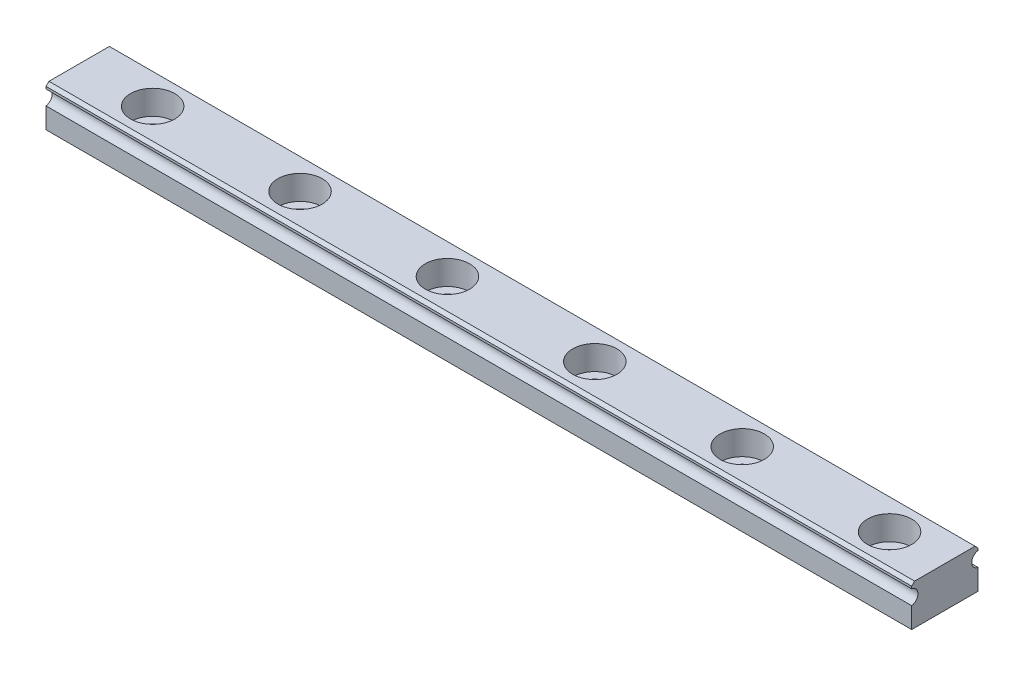
ISO-10303-21;
HEADER;
FILE_DESCRIPTION(('STEP AP214'),'2;1');
FILE_NAME('part.step','',(''),(''),'','','');
FILE_SCHEMA(('AUTOMOTIVE_DESIGN { 1 0 10303 214 1 1 1 1 }'));
ENDSEC;
DATA;
#1=APPLICATION_CONTEXT('core data for automotive mechanical design processes');
#2=APPLICATION_PROTOCOL_DEFINITION('international standard','automotive_design',2000,#1);
#3=PRODUCT_CONTEXT('',#1,'mechanical');
#4=PRODUCT('Part','Part','',(#3));
#5=PRODUCT_RELATED_PRODUCT_CATEGORY('part','',(#4));
#6=PRODUCT_DEFINITION_FORMATION('','',#4);
#7=PRODUCT_DEFINITION_CONTEXT('part definition',#1,'design');
#8=PRODUCT_DEFINITION('design','',#6,#7);
#9=PRODUCT_DEFINITION_SHAPE('','',#8);
#10=(LENGTH_UNIT() NAMED_UNIT(*) SI_UNIT(.MILLI.,.METRE.));
#11=(NAMED_UNIT(*) PLANE_ANGLE_UNIT() SI_UNIT($,.RADIAN.));
#12=(NAMED_UNIT(*) SI_UNIT($,.STERADIAN.) SOLID_ANGLE_UNIT());
#13=UNCERTAINTY_MEASURE_WITH_UNIT(LENGTH_MEASURE(1.E-05),#10,'distance_accuracy_value','');
#14=(GEOMETRIC_REPRESENTATION_CONTEXT(3) GLOBAL_UNCERTAINTY_ASSIGNED_CONTEXT((#13)) GLOBAL_UNIT_ASSIGNED_CONTEXT((#10,
#11,#12)) REPRESENTATION_CONTEXT('',''));
#15=CARTESIAN_POINT('',(0.,0.,0.));
#16=DIRECTION('',(0.,0.,1.));
#17=DIRECTION('',(1.,0.,0.));
#18=AXIS2_PLACEMENT_3D('',#15,#16,#17);
#19=CARTESIAN_POINT('',(187.5,4.78868599666426,-4.5));
#20=DIRECTION('',(0.,0.,1.));
#21=DIRECTION('',(1.,0.,0.));
#22=AXIS2_PLACEMENT_3D('',#19,#20,#21);
#23=PLANE('',#22);
#24=DIRECTION('',(1.,0.,0.));
#25=VECTOR('',#24,1.);
#26=CARTESIAN_POINT('',(187.5,4.78868599666426,-4.5));
#27=LINE('',#26,#25);
#28=CARTESIAN_POINT('',(187.5,4.78868599666426,-4.5));
#29=VERTEX_POINT('',#28);
#30=CARTESIAN_POINT('',(70.025,4.78868599666426,-4.5));
#31=VERTEX_POINT('',#30);
#32=EDGE_CURVE('E206',#29,#31,#27,.F.);
#33=ORIENTED_EDGE('',*,*,#32,.T.);
#34=DIRECTION('',(0.,1.,0.));
#35=VECTOR('',#34,1.);
#36=CARTESIAN_POINT('',(70.025,4.78868599666426,-4.5));
#37=LINE('',#36,#35);
#38=CARTESIAN_POINT('',(70.025,5.1,-4.5));
#39=VERTEX_POINT('',#38);
#40=EDGE_CURVE('E279',#31,#39,#37,.T.);
#41=ORIENTED_EDGE('',*,*,#40,.T.);
#42=DIRECTION('',(1.,0.,0.));
#43=VECTOR('',#42,1.);
#44=CARTESIAN_POINT('',(187.5,5.1,-4.5));
#45=LINE('',#44,#43);
#46=CARTESIAN_POINT('',(187.5,5.1,-4.5));
#47=VERTEX_POINT('',#46);
#48=EDGE_CURVE('E37',#39,#47,#45,.T.);
#49=ORIENTED_EDGE('',*,*,#48,.T.);
#50=DIRECTION('',(0.,1.,0.));
#51=VECTOR('',#50,1.);
#52=CARTESIAN_POINT('',(187.5,4.78868599666426,-4.5));
#53=LINE('',#52,#51);
#54=EDGE_CURVE('E90',#29,#47,#53,.T.);
#55=ORIENTED_EDGE('',*,*,#54,.F.);
#56=EDGE_LOOP('',(#33,#41,#49,#55));
#57=FACE_BOUND('',#56,.T.);
#58=ADVANCED_FACE('F34',(#57),#23,.F.);
#59=CARTESIAN_POINT('',(160.,0.,0.));
#60=DIRECTION('',(0.,1.,0.));
#61=DIRECTION('',(0.,0.,1.));
#62=AXIS2_PLACEMENT_3D('',#59,#60,#61);
#63=CYLINDRICAL_SURFACE('',#62,3.);
#64=CARTESIAN_POINT('',(160.,5.5,0.));
#65=DIRECTION('',(0.,1.,0.));
#66=DIRECTION('',(0.,0.,1.));
#67=AXIS2_PLACEMENT_3D('',#64,#65,#66);
#68=CIRCLE('',#67,3.);
#69=CARTESIAN_POINT('',(160.,5.5,3.));
#70=VERTEX_POINT('',#69);
#71=EDGE_CURVE('E203',#70,#70,#68,.T.);
#72=ORIENTED_EDGE('',*,*,#71,.T.);
#73=EDGE_LOOP('',(#72));
#74=FACE_BOUND('',#73,.T.);
#75=CARTESIAN_POINT('',(160.,2.2,0.));
#76=DIRECTION('',(0.,1.,0.));
#77=DIRECTION('',(0.,0.,1.));
#78=AXIS2_PLACEMENT_3D('',#75,#76,#77);
#79=CIRCLE('',#78,3.);
#80=CARTESIAN_POINT('',(160.,2.2,3.));
#81=VERTEX_POINT('',#80);
#82=EDGE_CURVE('E213',#81,#81,#79,.T.);
#83=ORIENTED_EDGE('',*,*,#82,.F.);
#84=EDGE_LOOP('',(#83));
#85=FACE_BOUND('',#84,.T.);
#86=ADVANCED_FACE('F580',(#74,#85),#63,.F.);
#87=CARTESIAN_POINT('',(120.,0.,0.));
#88=DIRECTION('',(0.,1.,0.));
#89=DIRECTION('',(0.,0.,1.));
#90=AXIS2_PLACEMENT_3D('',#87,#88,#89);
#91=CYLINDRICAL_SURFACE('',#90,3.);
#92=CARTESIAN_POINT('',(120.,5.5,0.));
#93=DIRECTION('',(0.,1.,0.));
#94=DIRECTION('',(0.,0.,1.));
#95=AXIS2_PLACEMENT_3D('',#92,#93,#94);
#96=CIRCLE('',#95,3.);
#97=CARTESIAN_POINT('',(120.,5.5,3.));
#98=VERTEX_POINT('',#97);
#99=EDGE_CURVE('E200',#98,#98,#96,.T.);
#100=ORIENTED_EDGE('',*,*,#99,.T.);
#101=EDGE_LOOP('',(#100));
#102=FACE_BOUND('',#101,.T.);
#103=CARTESIAN_POINT('',(120.,2.2,0.));
#104=DIRECTION('',(0.,1.,0.));
#105=DIRECTION('',(0.,0.,1.));
#106=AXIS2_PLACEMENT_3D('',#103,#104,#105);
#107=CIRCLE('',#106,3.);
#108=CARTESIAN_POINT('',(120.,2.2,3.));
#109=VERTEX_POINT('',#108);
#110=EDGE_CURVE('E210',#109,#109,#107,.T.);
#111=ORIENTED_EDGE('',*,*,#110,.F.);
#112=EDGE_LOOP('',(#111));
#113=FACE_BOUND('',#112,.T.);
#114=ADVANCED_FACE('F444',(#102,#113),#91,.F.);
#115=CARTESIAN_POINT('',(80.,0.,0.));
#116=DIRECTION('',(0.,1.,0.));
#117=DIRECTION('',(0.,0.,1.));
#118=AXIS2_PLACEMENT_3D('',#115,#116,#117);
#119=CYLINDRICAL_SURFACE('',#118,3.);
#120=CARTESIAN_POINT('',(80.,5.5,0.));
#121=DIRECTION('',(0.,1.,0.));
#122=DIRECTION('',(0.,0.,1.));
#123=AXIS2_PLACEMENT_3D('',#120,#121,#122);
#124=CIRCLE('',#123,3.);
#125=CARTESIAN_POINT('',(80.,5.5,3.));
#126=VERTEX_POINT('',#125);
#127=EDGE_CURVE('E109',#126,#126,#124,.T.);
#128=ORIENTED_EDGE('',*,*,#127,.T.);
#129=EDGE_LOOP('',(#128));
#130=FACE_BOUND('',#129,.T.);
#131=CARTESIAN_POINT('',(80.,2.2,0.));
#132=DIRECTION('',(0.,1.,0.));
#133=DIRECTION('',(0.,0.,1.));
#134=AXIS2_PLACEMENT_3D('',#131,#132,#133);
#135=CIRCLE('',#134,3.);
#136=CARTESIAN_POINT('',(80.,2.2,3.));
#137=VERTEX_POINT('',#136);
#138=EDGE_CURVE('E207',#137,#137,#135,.T.);
#139=ORIENTED_EDGE('',*,*,#138,.F.);
#140=EDGE_LOOP('',(#139));
#141=FACE_BOUND('',#140,.T.);
#142=ADVANCED_FACE('F317',(#130,#141),#119,.F.);
#143=CARTESIAN_POINT('',(187.5,5.1,-4.5));
#144=DIRECTION('',(0.,-0.707106781186548,0.707106781186547));
#145=DIRECTION('',(0.,-0.707106781186547,-0.707106781186548));
#146=AXIS2_PLACEMENT_3D('',#143,#144,#145);
#147=PLANE('',#146);
#148=ORIENTED_EDGE('',*,*,#48,.F.);
#149=DIRECTION('',(0.,0.707106781186547,0.707106781186548));
#150=VECTOR('',#149,1.);
#151=CARTESIAN_POINT('',(70.025,5.1,-4.5));
#152=LINE('',#151,#150);
#153=CARTESIAN_POINT('',(70.025,5.5,-4.1));
#154=VERTEX_POINT('',#153);
#155=EDGE_CURVE('E104',#39,#154,#152,.T.);
#156=ORIENTED_EDGE('',*,*,#155,.T.);
#157=DIRECTION('',(1.,0.,0.));
#158=VECTOR('',#157,1.);
#159=CARTESIAN_POINT('',(187.5,5.5,-4.1));
#160=LINE('',#159,#158);
#161=CARTESIAN_POINT('',(187.5,5.5,-4.1));
#162=VERTEX_POINT('',#161);
#163=EDGE_CURVE('E97',#154,#162,#160,.T.);
#164=ORIENTED_EDGE('',*,*,#163,.T.);
#165=DIRECTION('',(0.,-0.707106781186547,-0.707106781186548));
#166=VECTOR('',#165,1.);
#167=CARTESIAN_POINT('',(187.5,5.1,-4.5));
#168=LINE('',#167,#166);
#169=EDGE_CURVE('E101',#47,#162,#168,.F.);
#170=ORIENTED_EDGE('',*,*,#169,.F.);
#171=EDGE_LOOP('',(#148,#156,#164,#170));
#172=FACE_BOUND('',#171,.T.);
#173=ADVANCED_FACE('F100',(#172),#147,.F.);
#174=CARTESIAN_POINT('',(187.5,5.5,4.1));
#175=DIRECTION('',(0.,-0.707106781186548,-0.707106781186547));
#176=DIRECTION('',(0.,0.707106781186547,-0.707106781186548));
#177=AXIS2_PLACEMENT_3D('',#174,#175,#176);
#178=PLANE('',#177);
#179=DIRECTION('',(1.,0.,0.));
#180=VECTOR('',#179,1.);
#181=CARTESIAN_POINT('',(187.5,5.5,4.1));
#182=LINE('',#181,#180);
#183=CARTESIAN_POINT('',(187.5,5.5,4.1));
#184=VERTEX_POINT('',#183);
#185=CARTESIAN_POINT('',(70.025,5.5,4.1));
#186=VERTEX_POINT('',#185);
#187=EDGE_CURVE('E108',#184,#186,#182,.F.);
#188=ORIENTED_EDGE('',*,*,#187,.T.);
#189=DIRECTION('',(0.,-0.707106781186547,0.707106781186548));
#190=VECTOR('',#189,1.);
#191=CARTESIAN_POINT('',(70.025,5.5,4.1));
#192=LINE('',#191,#190);
#193=CARTESIAN_POINT('',(70.025,5.1,4.5));
#194=VERTEX_POINT('',#193);
#195=EDGE_CURVE('E284',#186,#194,#192,.T.);
#196=ORIENTED_EDGE('',*,*,#195,.T.);
#197=DIRECTION('',(-1.,0.,0.));
#198=VECTOR('',#197,1.);
#199=CARTESIAN_POINT('',(187.5,5.1,4.5));
#200=LINE('',#199,#198);
#201=CARTESIAN_POINT('',(187.5,5.1,4.5));
#202=VERTEX_POINT('',#201);
#203=EDGE_CURVE('E238',#194,#202,#200,.F.);
#204=ORIENTED_EDGE('',*,*,#203,.T.);
#205=DIRECTION('',(0.,0.707106781186547,-0.707106781186548));
#206=VECTOR('',#205,1.);
#207=CARTESIAN_POINT('',(187.5,5.5,4.1));
#208=LINE('',#207,#206);
#209=EDGE_CURVE('E118',#184,#202,#208,.F.);
#210=ORIENTED_EDGE('',*,*,#209,.F.);
#211=EDGE_LOOP('',(#188,#196,#204,#210));
#212=FACE_BOUND('',#211,.T.);
#213=ADVANCED_FACE('F307',(#212),#178,.F.);
#214=CARTESIAN_POINT('',(187.5,5.1,4.5));
#215=DIRECTION('',(0.,0.,-1.));
#216=DIRECTION('',(-1.,0.,0.));
#217=AXIS2_PLACEMENT_3D('',#214,#215,#216);
#218=PLANE('',#217);
#219=ORIENTED_EDGE('',*,*,#203,.F.);
#220=DIRECTION('',(0.,-1.,0.));
#221=VECTOR('',#220,1.);
#222=CARTESIAN_POINT('',(70.025,5.1,4.5));
#223=LINE('',#222,#221);
#224=CARTESIAN_POINT('',(70.025,4.78868599666426,4.5));
#225=VERTEX_POINT('',#224);
#226=EDGE_CURVE('E259',#194,#225,#223,.T.);
#227=ORIENTED_EDGE('',*,*,#226,.T.);
#228=DIRECTION('',(1.,0.,0.));
#229=VECTOR('',#228,1.);
#230=CARTESIAN_POINT('',(187.5,4.78868599666426,4.5));
#231=LINE('',#230,#229);
#232=CARTESIAN_POINT('',(187.5,4.78868599666426,4.5));
#233=VERTEX_POINT('',#232);
#234=EDGE_CURVE('E188',#225,#233,#231,.T.);
#235=ORIENTED_EDGE('',*,*,#234,.T.);
#236=DIRECTION('',(0.,1.,0.));
#237=VECTOR('',#236,1.);
#238=CARTESIAN_POINT('',(187.5,5.1,4.5));
#239=LINE('',#238,#237);
#240=EDGE_CURVE('E216',#202,#233,#239,.F.);
#241=ORIENTED_EDGE('',*,*,#240,.F.);
#242=EDGE_LOOP('',(#219,#227,#235,#241));
#243=FACE_BOUND('',#242,.T.);
#244=ADVANCED_FACE('F253',(#243),#218,.F.);
#245=CARTESIAN_POINT('',(100.,0.,0.));
#246=DIRECTION('',(0.,1.,0.));
#247=DIRECTION('',(0.,0.,1.));
#248=AXIS2_PLACEMENT_3D('',#245,#246,#247);
#249=CYLINDRICAL_SURFACE('',#248,3.);
#250=CARTESIAN_POINT('',(100.,5.5,0.));
#251=DIRECTION('',(0.,1.,0.));
#252=DIRECTION('',(0.,0.,1.));
#253=AXIS2_PLACEMENT_3D('',#250,#251,#252);
#254=CIRCLE('',#253,3.);
#255=CARTESIAN_POINT('',(100.,5.5,3.));
#256=VERTEX_POINT('',#255);
#257=EDGE_CURVE('E195',#256,#256,#254,.T.);
#258=ORIENTED_EDGE('',*,*,#257,.T.);
#259=EDGE_LOOP('',(#258));
#260=FACE_BOUND('',#259,.T.);
#261=CARTESIAN_POINT('',(100.,2.2,0.));
#262=DIRECTION('',(0.,1.,0.));
#263=DIRECTION('',(0.,0.,1.));
#264=AXIS2_PLACEMENT_3D('',#261,#262,#263);
#265=CIRCLE('',#264,3.);
#266=CARTESIAN_POINT('',(100.,2.2,3.));
#267=VERTEX_POINT('',#266);
#268=EDGE_CURVE('E185',#267,#267,#265,.T.);
#269=ORIENTED_EDGE('',*,*,#268,.F.);
#270=EDGE_LOOP('',(#269));
#271=FACE_BOUND('',#270,.T.);
#272=ADVANCED_FACE('F315',(#260,#271),#249,.F.);
#273=CARTESIAN_POINT('',(140.,0.,0.));
#274=DIRECTION('',(0.,1.,0.));
#275=DIRECTION('',(0.,0.,1.));
#276=AXIS2_PLACEMENT_3D('',#273,#274,#275);
#277=CYLINDRICAL_SURFACE('',#276,3.);
#278=CARTESIAN_POINT('',(140.,5.5,0.));
#279=DIRECTION('',(0.,1.,0.));
#280=DIRECTION('',(0.,0.,1.));
#281=AXIS2_PLACEMENT_3D('',#278,#279,#280);
#282=CIRCLE('',#281,3.);
#283=CARTESIAN_POINT('',(140.,5.5,3.));
#284=VERTEX_POINT('',#283);
#285=EDGE_CURVE('E192',#284,#284,#282,.T.);
#286=ORIENTED_EDGE('',*,*,#285,.T.);
#287=EDGE_LOOP('',(#286));
#288=FACE_BOUND('',#287,.T.);
#289=CARTESIAN_POINT('',(140.,2.2,0.));
#290=DIRECTION('',(0.,1.,0.));
#291=DIRECTION('',(0.,0.,1.));
#292=AXIS2_PLACEMENT_3D('',#289,#290,#291);
#293=CIRCLE('',#292,3.);
#294=CARTESIAN_POINT('',(140.,2.2,3.));
#295=VERTEX_POINT('',#294);
#296=EDGE_CURVE('E182',#295,#295,#293,.T.);
#297=ORIENTED_EDGE('',*,*,#296,.F.);
#298=EDGE_LOOP('',(#297));
#299=FACE_BOUND('',#298,.T.);
#300=ADVANCED_FACE('F397',(#288,#299),#277,.F.);
#301=CARTESIAN_POINT('',(180.,0.,0.));
#302=DIRECTION('',(0.,1.,0.));
#303=DIRECTION('',(0.,0.,1.));
#304=AXIS2_PLACEMENT_3D('',#301,#302,#303);
#305=CYLINDRICAL_SURFACE('',#304,3.);
#306=CARTESIAN_POINT('',(180.,5.5,0.));
#307=DIRECTION('',(0.,1.,0.));
#308=DIRECTION('',(0.,0.,1.));
#309=AXIS2_PLACEMENT_3D('',#306,#307,#308);
#310=CIRCLE('',#309,3.);
#311=CARTESIAN_POINT('',(180.,5.5,3.));
#312=VERTEX_POINT('',#311);
#313=EDGE_CURVE('E189',#312,#312,#310,.T.);
#314=ORIENTED_EDGE('',*,*,#313,.T.);
#315=EDGE_LOOP('',(#314));
#316=FACE_BOUND('',#315,.T.);
#317=CARTESIAN_POINT('',(180.,2.2,0.));
#318=DIRECTION('',(0.,1.,0.));
#319=DIRECTION('',(0.,0.,1.));
#320=AXIS2_PLACEMENT_3D('',#317,#318,#319);
#321=CIRCLE('',#320,3.);
#322=CARTESIAN_POINT('',(180.,2.2,3.));
#323=VERTEX_POINT('',#322);
#324=EDGE_CURVE('E179',#323,#323,#321,.T.);
#325=ORIENTED_EDGE('',*,*,#324,.F.);
#326=EDGE_LOOP('',(#325));
#327=FACE_BOUND('',#326,.T.);
#328=ADVANCED_FACE('F393',(#316,#327),#305,.F.);
#329=CARTESIAN_POINT('',(163.,2.2,0.));
#330=DIRECTION('',(0.,1.,0.));
#331=DIRECTION('',(0.,0.,1.));
#332=AXIS2_PLACEMENT_3D('',#329,#330,#331);
#333=PLANE('',#332);
#334=ORIENTED_EDGE('',*,*,#82,.T.);
#335=EDGE_LOOP('',(#334));
#336=FACE_BOUND('',#335,.T.);
#337=CARTESIAN_POINT('',(160.,2.2,0.));
#338=DIRECTION('',(0.,1.,0.));
#339=DIRECTION('',(0.,0.,1.));
#340=AXIS2_PLACEMENT_3D('',#337,#338,#339);
#341=CIRCLE('',#340,1.75);
#342=CARTESIAN_POINT('',(160.,2.2,1.75));
#343=VERTEX_POINT('',#342);
#344=EDGE_CURVE('E176',#343,#343,#341,.F.);
#345=ORIENTED_EDGE('',*,*,#344,.T.);
#346=EDGE_LOOP('',(#345));
#347=FACE_BOUND('',#346,.T.);
#348=ADVANCED_FACE('F389',(#336,#347),#333,.T.);
#349=CARTESIAN_POINT('',(123.,2.2,0.));
#350=DIRECTION('',(0.,1.,0.));
#351=DIRECTION('',(0.,0.,1.));
#352=AXIS2_PLACEMENT_3D('',#349,#350,#351);
#353=PLANE('',#352);
#354=ORIENTED_EDGE('',*,*,#110,.T.);
#355=EDGE_LOOP('',(#354));
#356=FACE_BOUND('',#355,.T.);
#357=CARTESIAN_POINT('',(120.,2.2,0.));
#358=DIRECTION('',(0.,1.,0.));
#359=DIRECTION('',(0.,0.,1.));
#360=AXIS2_PLACEMENT_3D('',#357,#358,#359);
#361=CIRCLE('',#360,1.75);
#362=CARTESIAN_POINT('',(120.,2.2,1.75));
#363=VERTEX_POINT('',#362);
#364=EDGE_CURVE('E173',#363,#363,#361,.F.);
#365=ORIENTED_EDGE('',*,*,#364,.T.);
#366=EDGE_LOOP('',(#365));
#367=FACE_BOUND('',#366,.T.);
#368=ADVANCED_FACE('F385',(#356,#367),#353,.T.);
#369=CARTESIAN_POINT('',(83.,2.2,0.));
#370=DIRECTION('',(0.,1.,0.));
#371=DIRECTION('',(0.,0.,1.));
#372=AXIS2_PLACEMENT_3D('',#369,#370,#371);
#373=PLANE('',#372);
#374=ORIENTED_EDGE('',*,*,#138,.T.);
#375=EDGE_LOOP('',(#374));
#376=FACE_BOUND('',#375,.T.);
#377=CARTESIAN_POINT('',(80.,2.2,0.));
#378=DIRECTION('',(0.,1.,0.));
#379=DIRECTION('',(0.,0.,1.));
#380=AXIS2_PLACEMENT_3D('',#377,#378,#379);
#381=CIRCLE('',#380,1.75);
#382=CARTESIAN_POINT('',(80.,2.2,1.75));
#383=VERTEX_POINT('',#382);
#384=EDGE_CURVE('E169',#383,#383,#381,.F.);
#385=ORIENTED_EDGE('',*,*,#384,.T.);
#386=EDGE_LOOP('',(#385));
#387=FACE_BOUND('',#386,.T.);
#388=ADVANCED_FACE('F381',(#376,#387),#373,.T.);
#389=CARTESIAN_POINT('',(187.5,3.8,-4.65));
#390=DIRECTION('',(1.,0.,0.));
#391=DIRECTION('',(0.,0.,-1.));
#392=AXIS2_PLACEMENT_3D('',#389,#390,#391);
#393=CYLINDRICAL_SURFACE('',#392,1.);
#394=DIRECTION('',(1.,0.,0.));
#395=VECTOR('',#394,1.);
#396=CARTESIAN_POINT('',(187.5,2.81131400333574,-4.5));
#397=LINE('',#396,#395);
#398=CARTESIAN_POINT('',(187.5,2.81131400333574,-4.5));
#399=VERTEX_POINT('',#398);
#400=CARTESIAN_POINT('',(70.025,2.81131400333574,-4.5));
#401=VERTEX_POINT('',#400);
#402=EDGE_CURVE('E167',#399,#401,#397,.F.);
#403=ORIENTED_EDGE('',*,*,#402,.T.);
#404=CARTESIAN_POINT('',(70.025,3.8,-4.65));
#405=DIRECTION('',(1.,0.,0.));
#406=DIRECTION('',(0.,0.,-1.));
#407=AXIS2_PLACEMENT_3D('',#404,#405,#406);
#408=CIRCLE('',#407,1.);
#409=EDGE_CURVE('E638',#401,#31,#408,.F.);
#410=ORIENTED_EDGE('',*,*,#409,.T.);
#411=ORIENTED_EDGE('',*,*,#32,.F.);
#412=CARTESIAN_POINT('',(187.5,3.8,-4.65));
#413=DIRECTION('',(1.,0.,0.));
#414=DIRECTION('',(0.,0.,-1.));
#415=AXIS2_PLACEMENT_3D('',#412,#413,#414);
#416=CIRCLE('',#415,1.);
#417=EDGE_CURVE('E125',#399,#29,#416,.F.);
#418=ORIENTED_EDGE('',*,*,#417,.F.);
#419=EDGE_LOOP('',(#403,#410,#411,#418));
#420=FACE_BOUND('',#419,.T.);
#421=ADVANCED_FACE('F377',(#420),#393,.F.);
#422=CARTESIAN_POINT('',(187.5,5.5,-4.1));
#423=DIRECTION('',(0.,-1.,0.));
#424=DIRECTION('',(0.,0.,-1.));
#425=AXIS2_PLACEMENT_3D('',#422,#423,#424);
#426=PLANE('',#425);
#427=ORIENTED_EDGE('',*,*,#313,.F.);
#428=EDGE_LOOP('',(#427));
#429=FACE_BOUND('',#428,.T.);
#430=ORIENTED_EDGE('',*,*,#285,.F.);
#431=EDGE_LOOP('',(#430));
#432=FACE_BOUND('',#431,.T.);
#433=ORIENTED_EDGE('',*,*,#257,.F.);
#434=EDGE_LOOP('',(#433));
#435=FACE_BOUND('',#434,.T.);
#436=ORIENTED_EDGE('',*,*,#163,.F.);
#437=DIRECTION('',(0.,0.,-1.));
#438=VECTOR('',#437,1.);
#439=CARTESIAN_POINT('',(70.025,5.5,10.004765604549));
#440=LINE('',#439,#438);
#441=EDGE_CURVE('E282',#186,#154,#440,.T.);
#442=ORIENTED_EDGE('',*,*,#441,.F.);
#443=ORIENTED_EDGE('',*,*,#187,.F.);
#444=DIRECTION('',(0.,0.,-1.));
#445=VECTOR('',#444,1.);
#446=CARTESIAN_POINT('',(187.5,5.5,-4.65));
#447=LINE('',#446,#445);
#448=EDGE_CURVE('E116',#162,#184,#447,.F.);
#449=ORIENTED_EDGE('',*,*,#448,.F.);
#450=EDGE_LOOP('',(#436,#442,#443,#449));
#451=FACE_BOUND('',#450,.T.);
#452=ORIENTED_EDGE('',*,*,#127,.F.);
#453=EDGE_LOOP('',(#452));
#454=FACE_BOUND('',#453,.T.);
#455=ORIENTED_EDGE('',*,*,#99,.F.);
#456=EDGE_LOOP('',(#455));
#457=FACE_BOUND('',#456,.T.);
#458=ORIENTED_EDGE('',*,*,#71,.F.);
#459=EDGE_LOOP('',(#458));
#460=FACE_BOUND('',#459,.T.);
#461=ADVANCED_FACE('F121',(#429,#432,#435,#451,#454,#457,#460),#426,.F.);
#462=CARTESIAN_POINT('',(187.5,3.8,4.65));
#463=DIRECTION('',(1.,0.,0.));
#464=DIRECTION('',(0.,0.,-1.));
#465=AXIS2_PLACEMENT_3D('',#462,#463,#464);
#466=CYLINDRICAL_SURFACE('',#465,1.);
#467=ORIENTED_EDGE('',*,*,#234,.F.);
#468=CARTESIAN_POINT('',(70.025,3.8,4.65));
#469=DIRECTION('',(1.,0.,0.));
#470=DIRECTION('',(0.,0.,-1.));
#471=AXIS2_PLACEMENT_3D('',#468,#469,#470);
#472=CIRCLE('',#471,1.);
#473=CARTESIAN_POINT('',(70.025,2.81131400333574,4.5));
#474=VERTEX_POINT('',#473);
#475=EDGE_CURVE('E265',#225,#474,#472,.F.);
#476=ORIENTED_EDGE('',*,*,#475,.T.);
#477=DIRECTION('',(-1.,0.,0.));
#478=VECTOR('',#477,1.);
#479=CARTESIAN_POINT('',(187.5,2.81131400333574,4.5));
#480=LINE('',#479,#478);
#481=CARTESIAN_POINT('',(187.5,2.81131400333574,4.5));
#482=VERTEX_POINT('',#481);
#483=EDGE_CURVE('E172',#474,#482,#480,.F.);
#484=ORIENTED_EDGE('',*,*,#483,.T.);
#485=CARTESIAN_POINT('',(187.5,3.8,4.65));
#486=DIRECTION('',(1.,0.,0.));
#487=DIRECTION('',(0.,0.,-1.));
#488=AXIS2_PLACEMENT_3D('',#485,#486,#487);
#489=CIRCLE('',#488,1.);
#490=EDGE_CURVE('E124',#233,#482,#489,.F.);
#491=ORIENTED_EDGE('',*,*,#490,.F.);
#492=EDGE_LOOP('',(#467,#476,#484,#491));
#493=FACE_BOUND('',#492,.T.);
#494=ADVANCED_FACE('F262',(#493),#466,.F.);
#495=CARTESIAN_POINT('',(103.,2.2,0.));
#496=DIRECTION('',(0.,1.,0.));
#497=DIRECTION('',(0.,0.,1.));
#498=AXIS2_PLACEMENT_3D('',#495,#496,#497);
#499=PLANE('',#498);
#500=ORIENTED_EDGE('',*,*,#268,.T.);
#501=EDGE_LOOP('',(#500));
#502=FACE_BOUND('',#501,.T.);
#503=CARTESIAN_POINT('',(100.,2.2,0.));
#504=DIRECTION('',(0.,1.,0.));
#505=DIRECTION('',(0.,0.,1.));
#506=AXIS2_PLACEMENT_3D('',#503,#504,#505);
#507=CIRCLE('',#506,1.75);
#508=CARTESIAN_POINT('',(100.,2.2,1.75));
#509=VERTEX_POINT('',#508);
#510=EDGE_CURVE('E165',#509,#509,#507,.F.);
#511=ORIENTED_EDGE('',*,*,#510,.T.);
#512=EDGE_LOOP('',(#511));
#513=FACE_BOUND('',#512,.T.);
#514=ADVANCED_FACE('F368',(#502,#513),#499,.T.);
#515=CARTESIAN_POINT('',(143.,2.2,0.));
#516=DIRECTION('',(0.,1.,0.));
#517=DIRECTION('',(0.,0.,1.));
#518=AXIS2_PLACEMENT_3D('',#515,#516,#517);
#519=PLANE('',#518);
#520=ORIENTED_EDGE('',*,*,#296,.T.);
#521=EDGE_LOOP('',(#520));
#522=FACE_BOUND('',#521,.T.);
#523=CARTESIAN_POINT('',(140.,2.2,0.));
#524=DIRECTION('',(0.,1.,0.));
#525=DIRECTION('',(0.,0.,1.));
#526=AXIS2_PLACEMENT_3D('',#523,#524,#525);
#527=CIRCLE('',#526,1.75);
#528=CARTESIAN_POINT('',(140.,2.2,1.75));
#529=VERTEX_POINT('',#528);
#530=EDGE_CURVE('E162',#529,#529,#527,.F.);
#531=ORIENTED_EDGE('',*,*,#530,.T.);
#532=EDGE_LOOP('',(#531));
#533=FACE_BOUND('',#532,.T.);
#534=ADVANCED_FACE('F364',(#522,#533),#519,.T.);
#535=CARTESIAN_POINT('',(183.,2.2,0.));
#536=DIRECTION('',(0.,1.,0.));
#537=DIRECTION('',(0.,0.,1.));
#538=AXIS2_PLACEMENT_3D('',#535,#536,#537);
#539=PLANE('',#538);
#540=ORIENTED_EDGE('',*,*,#324,.T.);
#541=EDGE_LOOP('',(#540));
#542=FACE_BOUND('',#541,.T.);
#543=CARTESIAN_POINT('',(180.,2.2,0.));
#544=DIRECTION('',(0.,1.,0.));
#545=DIRECTION('',(0.,0.,1.));
#546=AXIS2_PLACEMENT_3D('',#543,#544,#545);
#547=CIRCLE('',#546,1.75);
#548=CARTESIAN_POINT('',(180.,2.2,1.75));
#549=VERTEX_POINT('',#548);
#550=EDGE_CURVE('E159',#549,#549,#547,.F.);
#551=ORIENTED_EDGE('',*,*,#550,.T.);
#552=EDGE_LOOP('',(#551));
#553=FACE_BOUND('',#552,.T.);
#554=ADVANCED_FACE('F360',(#542,#553),#539,.T.);
#555=CARTESIAN_POINT('',(160.,0.,0.));
#556=DIRECTION('',(0.,1.,0.));
#557=DIRECTION('',(0.,0.,1.));
#558=AXIS2_PLACEMENT_3D('',#555,#556,#557);
#559=CYLINDRICAL_SURFACE('',#558,1.75);
#560=ORIENTED_EDGE('',*,*,#344,.F.);
#561=EDGE_LOOP('',(#560));
#562=FACE_BOUND('',#561,.T.);
#563=CARTESIAN_POINT('',(160.,0.,0.));
#564=DIRECTION('',(0.,1.,0.));
#565=DIRECTION('',(0.,0.,1.));
#566=AXIS2_PLACEMENT_3D('',#563,#564,#565);
#567=CIRCLE('',#566,1.75);
#568=CARTESIAN_POINT('',(160.,0.,1.75));
#569=VERTEX_POINT('',#568);
#570=EDGE_CURVE('E156',#569,#569,#567,.F.);
#571=ORIENTED_EDGE('',*,*,#570,.T.);
#572=EDGE_LOOP('',(#571));
#573=FACE_BOUND('',#572,.T.);
#574=ADVANCED_FACE('F356',(#562,#573),#559,.F.);
#575=CARTESIAN_POINT('',(120.,0.,0.));
#576=DIRECTION('',(0.,1.,0.));
#577=DIRECTION('',(0.,0.,1.));
#578=AXIS2_PLACEMENT_3D('',#575,#576,#577);
#579=CYLINDRICAL_SURFACE('',#578,1.75);
#580=ORIENTED_EDGE('',*,*,#364,.F.);
#581=EDGE_LOOP('',(#580));
#582=FACE_BOUND('',#581,.T.);
#583=CARTESIAN_POINT('',(120.,0.,0.));
#584=DIRECTION('',(0.,1.,0.));
#585=DIRECTION('',(0.,0.,1.));
#586=AXIS2_PLACEMENT_3D('',#583,#584,#585);
#587=CIRCLE('',#586,1.75);
#588=CARTESIAN_POINT('',(120.,0.,1.75));
#589=VERTEX_POINT('',#588);
#590=EDGE_CURVE('E153',#589,#589,#587,.F.);
#591=ORIENTED_EDGE('',*,*,#590,.T.);
#592=EDGE_LOOP('',(#591));
#593=FACE_BOUND('',#592,.T.);
#594=ADVANCED_FACE('F352',(#582,#593),#579,.F.);
#595=CARTESIAN_POINT('',(80.,0.,0.));
#596=DIRECTION('',(0.,1.,0.));
#597=DIRECTION('',(0.,0.,1.));
#598=AXIS2_PLACEMENT_3D('',#595,#596,#597);
#599=CYLINDRICAL_SURFACE('',#598,1.75);
#600=ORIENTED_EDGE('',*,*,#384,.F.);
#601=EDGE_LOOP('',(#600));
#602=FACE_BOUND('',#601,.T.);
#603=CARTESIAN_POINT('',(80.,0.,0.));
#604=DIRECTION('',(0.,1.,0.));
#605=DIRECTION('',(0.,0.,1.));
#606=AXIS2_PLACEMENT_3D('',#603,#604,#605);
#607=CIRCLE('',#606,1.75);
#608=CARTESIAN_POINT('',(80.,0.,1.75));
#609=VERTEX_POINT('',#608);
#610=EDGE_CURVE('E149',#609,#609,#607,.F.);
#611=ORIENTED_EDGE('',*,*,#610,.T.);
#612=EDGE_LOOP('',(#611));
#613=FACE_BOUND('',#612,.T.);
#614=ADVANCED_FACE('F349',(#602,#613),#599,.F.);
#615=CARTESIAN_POINT('',(187.5,2.81131400333574,4.5));
#616=DIRECTION('',(0.,0.,-1.));
#617=DIRECTION('',(-1.,0.,0.));
#618=AXIS2_PLACEMENT_3D('',#615,#616,#617);
#619=PLANE('',#618);
#620=ORIENTED_EDGE('',*,*,#483,.F.);
#621=DIRECTION('',(0.,-1.,0.));
#622=VECTOR('',#621,1.);
#623=CARTESIAN_POINT('',(70.025,2.81131400333574,4.5));
#624=LINE('',#623,#622);
#625=CARTESIAN_POINT('',(70.025,0.,4.5));
#626=VERTEX_POINT('',#625);
#627=EDGE_CURVE('E298',#474,#626,#624,.T.);
#628=ORIENTED_EDGE('',*,*,#627,.T.);
#629=DIRECTION('',(1.,0.,0.));
#630=VECTOR('',#629,1.);
#631=CARTESIAN_POINT('',(187.5,0.,4.5));
#632=LINE('',#631,#630);
#633=CARTESIAN_POINT('',(187.5,0.,4.5));
#634=VERTEX_POINT('',#633);
#635=EDGE_CURVE('E152',#626,#634,#632,.T.);
#636=ORIENTED_EDGE('',*,*,#635,.T.);
#637=DIRECTION('',(0.,1.,0.));
#638=VECTOR('',#637,1.);
#639=CARTESIAN_POINT('',(187.5,3.8,4.5));
#640=LINE('',#639,#638);
#641=EDGE_CURVE('E129',#482,#634,#640,.F.);
#642=ORIENTED_EDGE('',*,*,#641,.F.);
#643=EDGE_LOOP('',(#620,#628,#636,#642));
#644=FACE_BOUND('',#643,.T.);
#645=ADVANCED_FACE('F295',(#644),#619,.F.);
#646=CARTESIAN_POINT('',(187.5,3.8,-4.65));
#647=DIRECTION('',(1.,0.,0.));
#648=DIRECTION('',(0.,0.,-1.));
#649=AXIS2_PLACEMENT_3D('',#646,#647,#648);
#650=PLANE('',#649);
#651=ORIENTED_EDGE('',*,*,#240,.T.);
#652=ORIENTED_EDGE('',*,*,#490,.T.);
#653=ORIENTED_EDGE('',*,*,#641,.T.);
#654=DIRECTION('',(0.,0.,1.));
#655=VECTOR('',#654,1.);
#656=CARTESIAN_POINT('',(187.5,0.,4.5));
#657=LINE('',#656,#655);
#658=CARTESIAN_POINT('',(187.5,0.,-4.5));
#659=VERTEX_POINT('',#658);
#660=EDGE_CURVE('E218',#634,#659,#657,.F.);
#661=ORIENTED_EDGE('',*,*,#660,.T.);
#662=DIRECTION('',(0.,1.,0.));
#663=VECTOR('',#662,1.);
#664=CARTESIAN_POINT('',(187.5,0.,-4.5));
#665=LINE('',#664,#663);
#666=EDGE_CURVE('E59',#659,#399,#665,.T.);
#667=ORIENTED_EDGE('',*,*,#666,.T.);
#668=ORIENTED_EDGE('',*,*,#417,.T.);
#669=ORIENTED_EDGE('',*,*,#54,.T.);
#670=ORIENTED_EDGE('',*,*,#169,.T.);
#671=ORIENTED_EDGE('',*,*,#448,.T.);
#672=ORIENTED_EDGE('',*,*,#209,.T.);
#673=EDGE_LOOP('',(#651,#652,#653,#661,#667,#668,#669,#670,#671,#672));
#674=FACE_BOUND('',#673,.T.);
#675=ADVANCED_FACE('F114',(#674),#650,.T.);
#676=CARTESIAN_POINT('',(187.5,0.,-4.5));
#677=DIRECTION('',(0.,0.,1.));
#678=DIRECTION('',(1.,0.,0.));
#679=AXIS2_PLACEMENT_3D('',#676,#677,#678);
#680=PLANE('',#679);
#681=DIRECTION('',(1.,0.,0.));
#682=VECTOR('',#681,1.);
#683=CARTESIAN_POINT('',(187.5,0.,-4.5));
#684=LINE('',#683,#682);
#685=CARTESIAN_POINT('',(70.025,0.,-4.5));
#686=VERTEX_POINT('',#685);
#687=EDGE_CURVE('E148',#659,#686,#684,.F.);
#688=ORIENTED_EDGE('',*,*,#687,.T.);
#689=DIRECTION('',(0.,1.,0.));
#690=VECTOR('',#689,1.);
#691=CARTESIAN_POINT('',(70.025,0.,-4.5));
#692=LINE('',#691,#690);
#693=EDGE_CURVE('E51',#686,#401,#692,.T.);
#694=ORIENTED_EDGE('',*,*,#693,.T.);
#695=ORIENTED_EDGE('',*,*,#402,.F.);
#696=ORIENTED_EDGE('',*,*,#666,.F.);
#697=EDGE_LOOP('',(#688,#694,#695,#696));
#698=FACE_BOUND('',#697,.T.);
#699=ADVANCED_FACE('F342',(#698),#680,.F.);
#700=CARTESIAN_POINT('',(100.,0.,0.));
#701=DIRECTION('',(0.,1.,0.));
#702=DIRECTION('',(0.,0.,1.));
#703=AXIS2_PLACEMENT_3D('',#700,#701,#702);
#704=CYLINDRICAL_SURFACE('',#703,1.75);
#705=ORIENTED_EDGE('',*,*,#510,.F.);
#706=EDGE_LOOP('',(#705));
#707=FACE_BOUND('',#706,.T.);
#708=CARTESIAN_POINT('',(100.,0.,0.));
#709=DIRECTION('',(0.,1.,0.));
#710=DIRECTION('',(0.,0.,1.));
#711=AXIS2_PLACEMENT_3D('',#708,#709,#710);
#712=CIRCLE('',#711,1.75);
#713=CARTESIAN_POINT('',(100.,0.,1.75));
#714=VERTEX_POINT('',#713);
#715=EDGE_CURVE('E145',#714,#714,#712,.F.);
#716=ORIENTED_EDGE('',*,*,#715,.T.);
#717=EDGE_LOOP('',(#716));
#718=FACE_BOUND('',#717,.T.);
#719=ADVANCED_FACE('F338',(#707,#718),#704,.F.);
#720=CARTESIAN_POINT('',(140.,0.,0.));
#721=DIRECTION('',(0.,1.,0.));
#722=DIRECTION('',(0.,0.,1.));
#723=AXIS2_PLACEMENT_3D('',#720,#721,#722);
#724=CYLINDRICAL_SURFACE('',#723,1.75);
#725=ORIENTED_EDGE('',*,*,#530,.F.);
#726=EDGE_LOOP('',(#725));
#727=FACE_BOUND('',#726,.T.);
#728=CARTESIAN_POINT('',(140.,0.,0.));
#729=DIRECTION('',(0.,1.,0.));
#730=DIRECTION('',(0.,0.,1.));
#731=AXIS2_PLACEMENT_3D('',#728,#729,#730);
#732=CIRCLE('',#731,1.75);
#733=CARTESIAN_POINT('',(140.,0.,1.75));
#734=VERTEX_POINT('',#733);
#735=EDGE_CURVE('E142',#734,#734,#732,.F.);
#736=ORIENTED_EDGE('',*,*,#735,.T.);
#737=EDGE_LOOP('',(#736));
#738=FACE_BOUND('',#737,.T.);
#739=ADVANCED_FACE('F330',(#727,#738),#724,.F.);
#740=CARTESIAN_POINT('',(180.,0.,0.));
#741=DIRECTION('',(0.,1.,0.));
#742=DIRECTION('',(0.,0.,1.));
#743=AXIS2_PLACEMENT_3D('',#740,#741,#742);
#744=CYLINDRICAL_SURFACE('',#743,1.75);
#745=ORIENTED_EDGE('',*,*,#550,.F.);
#746=EDGE_LOOP('',(#745));
#747=FACE_BOUND('',#746,.T.);
#748=CARTESIAN_POINT('',(180.,0.,0.));
#749=DIRECTION('',(0.,1.,0.));
#750=DIRECTION('',(0.,0.,1.));
#751=AXIS2_PLACEMENT_3D('',#748,#749,#750);
#752=CIRCLE('',#751,1.75);
#753=CARTESIAN_POINT('',(180.,0.,1.75));
#754=VERTEX_POINT('',#753);
#755=EDGE_CURVE('E43',#754,#754,#752,.F.);
#756=ORIENTED_EDGE('',*,*,#755,.T.);
#757=EDGE_LOOP('',(#756));
#758=FACE_BOUND('',#757,.T.);
#759=ADVANCED_FACE('F320',(#747,#758),#744,.F.);
#760=CARTESIAN_POINT('',(187.5,0.,4.5));
#761=DIRECTION('',(0.,1.,0.));
#762=DIRECTION('',(0.,0.,1.));
#763=AXIS2_PLACEMENT_3D('',#760,#761,#762);
#764=PLANE('',#763);
#765=ORIENTED_EDGE('',*,*,#755,.F.);
#766=EDGE_LOOP('',(#765));
#767=FACE_BOUND('',#766,.T.);
#768=ORIENTED_EDGE('',*,*,#735,.F.);
#769=EDGE_LOOP('',(#768));
#770=FACE_BOUND('',#769,.T.);
#771=ORIENTED_EDGE('',*,*,#715,.F.);
#772=EDGE_LOOP('',(#771));
#773=FACE_BOUND('',#772,.T.);
#774=ORIENTED_EDGE('',*,*,#635,.F.);
#775=DIRECTION('',(0.,0.,-1.));
#776=VECTOR('',#775,1.);
#777=CARTESIAN_POINT('',(70.025,0.,4.5));
#778=LINE('',#777,#776);
#779=EDGE_CURVE('E11',#626,#686,#778,.T.);
#780=ORIENTED_EDGE('',*,*,#779,.T.);
#781=ORIENTED_EDGE('',*,*,#687,.F.);
#782=ORIENTED_EDGE('',*,*,#660,.F.);
#783=EDGE_LOOP('',(#774,#780,#781,#782));
#784=FACE_BOUND('',#783,.T.);
#785=ORIENTED_EDGE('',*,*,#610,.F.);
#786=EDGE_LOOP('',(#785));
#787=FACE_BOUND('',#786,.T.);
#788=ORIENTED_EDGE('',*,*,#590,.F.);
#789=EDGE_LOOP('',(#788));
#790=FACE_BOUND('',#789,.T.);
#791=ORIENTED_EDGE('',*,*,#570,.F.);
#792=EDGE_LOOP('',(#791));
#793=FACE_BOUND('',#792,.T.);
#794=ADVANCED_FACE('F300',(#767,#770,#773,#784,#787,#790,#793),#764,.F.);
#795=CARTESIAN_POINT('',(70.025,-0.000103077640657354,10.004765604549));
#796=DIRECTION('',(1.,0.,0.));
#797=DIRECTION('',(0.,0.,-1.));
#798=AXIS2_PLACEMENT_3D('',#795,#796,#797);
#799=PLANE('',#798);
#800=ORIENTED_EDGE('',*,*,#40,.F.);
#801=ORIENTED_EDGE('',*,*,#409,.F.);
#802=ORIENTED_EDGE('',*,*,#693,.F.);
#803=ORIENTED_EDGE('',*,*,#779,.F.);
#804=ORIENTED_EDGE('',*,*,#627,.F.);
#805=ORIENTED_EDGE('',*,*,#475,.F.);
#806=ORIENTED_EDGE('',*,*,#226,.F.);
#807=ORIENTED_EDGE('',*,*,#195,.F.);
#808=ORIENTED_EDGE('',*,*,#441,.T.);
#809=ORIENTED_EDGE('',*,*,#155,.F.);
#810=EDGE_LOOP('',(#800,#801,#802,#803,#804,#805,#806,#807,#808,#809));
#811=FACE_BOUND('',#810,.T.);
#812=ADVANCED_FACE('F278',(#811),#799,.F.);
#813=CLOSED_SHELL('',(#58,#86,#114,#142,#173,#213,#244,#272,#300,#328,#348,#368,#388,#421,#461,
#494,#514,#534,#554,#574,#594,#614,#645,#675,#699,#719,#739,#759,#794,#812));
#814=MANIFOLD_SOLID_BREP('B2',#813);
#815=ADVANCED_BREP_SHAPE_REPRESENTATION('',(#18,#814),#14);
#816=SHAPE_DEFINITION_REPRESENTATION(#9,#815);
ENDSEC;
END-ISO-10303-21;
